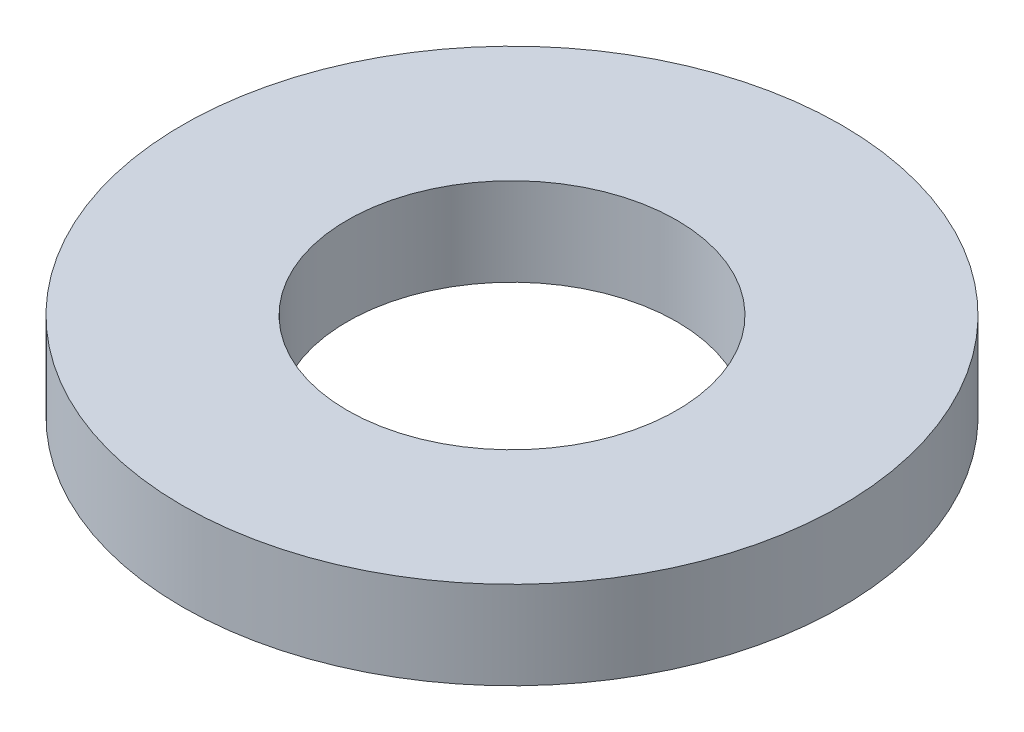
ISO-10303-21;
HEADER;
FILE_DESCRIPTION(('STEP AP214'),'2;1');
FILE_NAME('part.step','',(''),(''),'','','');
FILE_SCHEMA(('AUTOMOTIVE_DESIGN { 1 0 10303 214 1 1 1 1 }'));
ENDSEC;
DATA;
#1=APPLICATION_CONTEXT('core data for automotive mechanical design processes');
#2=APPLICATION_PROTOCOL_DEFINITION('international standard','automotive_design',2000,#1);
#3=PRODUCT_CONTEXT('',#1,'mechanical');
#4=PRODUCT('Part','Part','',(#3));
#5=PRODUCT_RELATED_PRODUCT_CATEGORY('part','',(#4));
#6=PRODUCT_DEFINITION_FORMATION('','',#4);
#7=PRODUCT_DEFINITION_CONTEXT('part definition',#1,'design');
#8=PRODUCT_DEFINITION('design','',#6,#7);
#9=PRODUCT_DEFINITION_SHAPE('','',#8);
#10=(LENGTH_UNIT() NAMED_UNIT(*) SI_UNIT(.MILLI.,.METRE.));
#11=(NAMED_UNIT(*) PLANE_ANGLE_UNIT() SI_UNIT($,.RADIAN.));
#12=(NAMED_UNIT(*) SI_UNIT($,.STERADIAN.) SOLID_ANGLE_UNIT());
#13=UNCERTAINTY_MEASURE_WITH_UNIT(LENGTH_MEASURE(1.E-05),#10,'distance_accuracy_value','');
#14=(GEOMETRIC_REPRESENTATION_CONTEXT(3) GLOBAL_UNCERTAINTY_ASSIGNED_CONTEXT((#13)) GLOBAL_UNIT_ASSIGNED_CONTEXT((#10,
#11,#12)) REPRESENTATION_CONTEXT('',''));
#15=CARTESIAN_POINT('',(0.,0.,0.));
#16=DIRECTION('',(0.,0.,1.));
#17=DIRECTION('',(1.,0.,0.));
#18=AXIS2_PLACEMENT_3D('',#15,#16,#17);
#19=CARTESIAN_POINT('',(0.,0.8,0.));
#20=DIRECTION('',(0.,1.,0.));
#21=DIRECTION('',(0.,0.,1.));
#22=AXIS2_PLACEMENT_3D('',#19,#20,#21);
#23=PLANE('',#22);
#24=CARTESIAN_POINT('',(0.,0.8,0.));
#25=DIRECTION('',(0.,1.,0.));
#26=DIRECTION('',(0.,0.,1.));
#27=AXIS2_PLACEMENT_3D('',#24,#25,#26);
#28=CIRCLE('',#27,3.);
#29=CARTESIAN_POINT('',(0.,0.8,3.));
#30=VERTEX_POINT('',#29);
#31=EDGE_CURVE('E10',#30,#30,#28,.T.);
#32=ORIENTED_EDGE('',*,*,#31,.T.);
#33=EDGE_LOOP('',(#32));
#34=FACE_BOUND('',#33,.T.);
#35=CARTESIAN_POINT('',(0.,0.8,0.));
#36=DIRECTION('',(0.,1.,0.));
#37=DIRECTION('',(0.,0.,1.));
#38=AXIS2_PLACEMENT_3D('',#35,#36,#37);
#39=CIRCLE('',#38,1.5);
#40=CARTESIAN_POINT('',(0.,0.8,1.5));
#41=VERTEX_POINT('',#40);
#42=EDGE_CURVE('E44',#41,#41,#39,.T.);
#43=ORIENTED_EDGE('',*,*,#42,.F.);
#44=EDGE_LOOP('',(#43));
#45=FACE_BOUND('',#44,.T.);
#46=ADVANCED_FACE('F33',(#34,#45),#23,.T.);
#47=CARTESIAN_POINT('',(0.,0.,0.));
#48=DIRECTION('',(0.,1.,0.));
#49=DIRECTION('',(0.,0.,1.));
#50=AXIS2_PLACEMENT_3D('',#47,#48,#49);
#51=PLANE('',#50);
#52=CARTESIAN_POINT('',(0.,0.,0.));
#53=DIRECTION('',(0.,1.,0.));
#54=DIRECTION('',(0.,0.,1.));
#55=AXIS2_PLACEMENT_3D('',#52,#53,#54);
#56=CIRCLE('',#55,3.);
#57=CARTESIAN_POINT('',(0.,0.,3.));
#58=VERTEX_POINT('',#57);
#59=EDGE_CURVE('E37',#58,#58,#56,.T.);
#60=ORIENTED_EDGE('',*,*,#59,.F.);
#61=EDGE_LOOP('',(#60));
#62=FACE_BOUND('',#61,.T.);
#63=CARTESIAN_POINT('',(0.,0.,0.));
#64=DIRECTION('',(0.,1.,0.));
#65=DIRECTION('',(0.,0.,1.));
#66=AXIS2_PLACEMENT_3D('',#63,#64,#65);
#67=CIRCLE('',#66,1.5);
#68=CARTESIAN_POINT('',(0.,0.,1.5));
#69=VERTEX_POINT('',#68);
#70=EDGE_CURVE('E46',#69,#69,#67,.T.);
#71=ORIENTED_EDGE('',*,*,#70,.T.);
#72=EDGE_LOOP('',(#71));
#73=FACE_BOUND('',#72,.T.);
#74=ADVANCED_FACE('F56',(#62,#73),#51,.F.);
#75=CARTESIAN_POINT('',(0.,0.8,0.));
#76=DIRECTION('',(0.,-1.,0.));
#77=DIRECTION('',(0.,0.,-1.));
#78=AXIS2_PLACEMENT_3D('',#75,#76,#77);
#79=CYLINDRICAL_SURFACE('',#78,3.);
#80=ORIENTED_EDGE('',*,*,#31,.F.);
#81=EDGE_LOOP('',(#80));
#82=FACE_BOUND('',#81,.T.);
#83=ORIENTED_EDGE('',*,*,#59,.T.);
#84=EDGE_LOOP('',(#83));
#85=FACE_BOUND('',#84,.T.);
#86=ADVANCED_FACE('F35',(#82,#85),#79,.T.);
#87=CARTESIAN_POINT('',(0.,0.8,0.));
#88=DIRECTION('',(0.,-1.,0.));
#89=DIRECTION('',(0.,0.,-1.));
#90=AXIS2_PLACEMENT_3D('',#87,#88,#89);
#91=CYLINDRICAL_SURFACE('',#90,1.5);
#92=ORIENTED_EDGE('',*,*,#42,.T.);
#93=EDGE_LOOP('',(#92));
#94=FACE_BOUND('',#93,.T.);
#95=ORIENTED_EDGE('',*,*,#70,.F.);
#96=EDGE_LOOP('',(#95));
#97=FACE_BOUND('',#96,.T.);
#98=ADVANCED_FACE('F52',(#94,#97),#91,.F.);
#99=CLOSED_SHELL('',(#46,#74,#86,#98));
#100=MANIFOLD_SOLID_BREP('B2',#99);
#101=ADVANCED_BREP_SHAPE_REPRESENTATION('',(#18,#100),#14);
#102=SHAPE_DEFINITION_REPRESENTATION(#9,#101);
ENDSEC;
END-ISO-10303-21;
